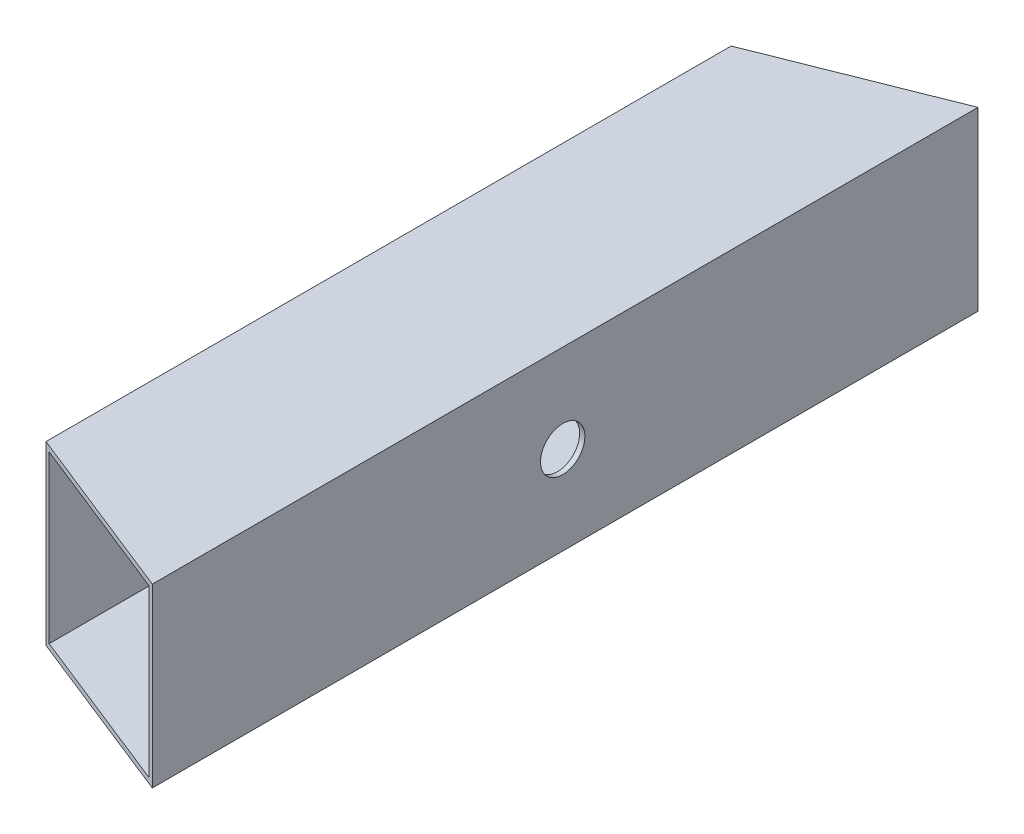
ISO-10303-21;
HEADER;
FILE_DESCRIPTION(('STEP AP214'),'2;1');
FILE_NAME('part.step','',(''),(''),'','','');
FILE_SCHEMA(('AUTOMOTIVE_DESIGN { 1 0 10303 214 1 1 1 1 }'));
ENDSEC;
DATA;
#1=APPLICATION_CONTEXT('core data for automotive mechanical design processes');
#2=APPLICATION_PROTOCOL_DEFINITION('international standard','automotive_design',2000,#1);
#3=PRODUCT_CONTEXT('',#1,'mechanical');
#4=PRODUCT('Part','Part','',(#3));
#5=PRODUCT_RELATED_PRODUCT_CATEGORY('part','',(#4));
#6=PRODUCT_DEFINITION_FORMATION('','',#4);
#7=PRODUCT_DEFINITION_CONTEXT('part definition',#1,'design');
#8=PRODUCT_DEFINITION('design','',#6,#7);
#9=PRODUCT_DEFINITION_SHAPE('','',#8);
#10=(LENGTH_UNIT() NAMED_UNIT(*) SI_UNIT(.MILLI.,.METRE.));
#11=(NAMED_UNIT(*) PLANE_ANGLE_UNIT() SI_UNIT($,.RADIAN.));
#12=(NAMED_UNIT(*) SI_UNIT($,.STERADIAN.) SOLID_ANGLE_UNIT());
#13=UNCERTAINTY_MEASURE_WITH_UNIT(LENGTH_MEASURE(1.E-05),#10,'distance_accuracy_value','');
#14=(GEOMETRIC_REPRESENTATION_CONTEXT(3) GLOBAL_UNCERTAINTY_ASSIGNED_CONTEXT((#13)) GLOBAL_UNIT_ASSIGNED_CONTEXT((#10,
#11,#12)) REPRESENTATION_CONTEXT('',''));
#15=CARTESIAN_POINT('',(0.,0.,0.));
#16=DIRECTION('',(0.,0.,1.));
#17=DIRECTION('',(1.,0.,0.));
#18=AXIS2_PLACEMENT_3D('',#15,#16,#17);
#19=CARTESIAN_POINT('',(-15.9452234480182,15.9452234480182,149.11688245));
#20=DIRECTION('',(0.,-1.,0.));
#21=DIRECTION('',(0.,0.,-1.));
#22=AXIS2_PLACEMENT_3D('',#19,#20,#21);
#23=PLANE('',#22);
#24=DIRECTION('',(0.,0.,-1.));
#25=VECTOR('',#24,1.);
#26=CARTESIAN_POINT('',(-15.9452234480182,15.9452234480182,149.11688245));
#27=LINE('',#26,#25);
#28=CARTESIAN_POINT('',(-15.9452234480182,15.9452234480182,136.424287616364));
#29=VERTEX_POINT('',#28);
#30=CARTESIAN_POINT('',(-15.9452234480182,15.9452234480182,12.6925948336361));
#31=VERTEX_POINT('',#30);
#32=EDGE_CURVE('E120',#29,#31,#27,.T.);
#33=ORIENTED_EDGE('',*,*,#32,.F.);
#34=DIRECTION('',(0.92911410701226,0.,0.369793153196229));
#35=VECTOR('',#34,1.);
#36=CARTESIAN_POINT('',(-11.5843012668873,15.9452234480182,138.159961579371));
#37=LINE('',#36,#35);
#38=CARTESIAN_POINT('',(15.9452234480182,15.9452259480182,149.11688245));
#39=VERTEX_POINT('',#38);
#40=EDGE_CURVE('E104',#29,#39,#37,.T.);
#41=ORIENTED_EDGE('',*,*,#40,.T.);
#42=DIRECTION('',(0.,0.,-1.));
#43=VECTOR('',#42,1.);
#44=CARTESIAN_POINT('',(15.9452234480182,15.9452234480182,149.11688245));
#45=LINE('',#44,#43);
#46=CARTESIAN_POINT('',(15.9452234480182,15.9452234480182,0.));
#47=VERTEX_POINT('',#46);
#48=EDGE_CURVE('E42',#39,#47,#45,.T.);
#49=ORIENTED_EDGE('',*,*,#48,.T.);
#50=DIRECTION('',(0.92911410701226,0.,-0.369793153196229));
#51=VECTOR('',#50,1.);
#52=CARTESIAN_POINT('',(-62.8178850045487,15.9452234480182,31.3482036387022));
#53=LINE('',#52,#51);
#54=EDGE_CURVE('E153',#31,#47,#53,.T.);
#55=ORIENTED_EDGE('',*,*,#54,.F.);
#56=EDGE_LOOP('',(#33,#41,#49,#55));
#57=FACE_BOUND('',#56,.T.);
#58=ADVANCED_FACE('F33',(#57),#23,.F.);
#59=CARTESIAN_POINT('',(-15.9452234480182,-15.9452234480182,149.11688245));
#60=DIRECTION('',(1.,0.,0.));
#61=DIRECTION('',(0.,0.,-1.));
#62=AXIS2_PLACEMENT_3D('',#59,#60,#61);
#63=PLANE('',#62);
#64=CARTESIAN_POINT('',(-15.9452234480182,0.,75.));
#65=DIRECTION('',(-1.,0.,0.));
#66=DIRECTION('',(0.,0.,1.));
#67=AXIS2_PLACEMENT_3D('',#64,#65,#66);
#68=CIRCLE('',#67,4.00000000000001);
#69=CARTESIAN_POINT('',(-15.9452234480182,0.,79.));
#70=VERTEX_POINT('',#69);
#71=EDGE_CURVE('E307',#70,#70,#68,.T.);
#72=ORIENTED_EDGE('',*,*,#71,.F.);
#73=EDGE_LOOP('',(#72));
#74=FACE_BOUND('',#73,.T.);
#75=DIRECTION('',(0.,0.,-1.));
#76=VECTOR('',#75,1.);
#77=CARTESIAN_POINT('',(-15.9452234480182,-15.9452234480182,149.11688245));
#78=LINE('',#77,#76);
#79=CARTESIAN_POINT('',(-15.9452234480182,-15.9452234480182,136.424287616364));
#80=VERTEX_POINT('',#79);
#81=CARTESIAN_POINT('',(-15.9452234480182,-15.9452234480182,12.6925948336361));
#82=VERTEX_POINT('',#81);
#83=EDGE_CURVE('E124',#80,#82,#78,.T.);
#84=ORIENTED_EDGE('',*,*,#83,.F.);
#85=DIRECTION('',(0.,1.,0.));
#86=VECTOR('',#85,1.);
#87=CARTESIAN_POINT('',(-15.9452234480182,-15.9452484480182,136.424287616364));
#88=LINE('',#87,#86);
#89=EDGE_CURVE('E172',#80,#29,#88,.T.);
#90=ORIENTED_EDGE('',*,*,#89,.T.);
#91=ORIENTED_EDGE('',*,*,#32,.T.);
#92=DIRECTION('',(0.,1.,0.));
#93=VECTOR('',#92,1.);
#94=CARTESIAN_POINT('',(-15.9452234480182,-15.9452234480182,12.6925948336361));
#95=LINE('',#94,#93);
#96=EDGE_CURVE('E142',#82,#31,#95,.T.);
#97=ORIENTED_EDGE('',*,*,#96,.F.);
#98=EDGE_LOOP('',(#84,#90,#91,#97));
#99=FACE_BOUND('',#98,.T.);
#100=ADVANCED_FACE('F171',(#74,#99),#63,.F.);
#101=CARTESIAN_POINT('',(-15.9452234480182,-15.9452234480182,149.11688245));
#102=DIRECTION('',(0.,1.,0.));
#103=DIRECTION('',(0.,0.,1.));
#104=AXIS2_PLACEMENT_3D('',#101,#102,#103);
#105=PLANE('',#104);
#106=DIRECTION('',(0.,0.,-1.));
#107=VECTOR('',#106,1.);
#108=CARTESIAN_POINT('',(15.9452234480182,-15.9452234480182,149.11688245));
#109=LINE('',#108,#107);
#110=CARTESIAN_POINT('',(15.9452234480182,-15.9452259480182,149.11688245));
#111=VERTEX_POINT('',#110);
#112=CARTESIAN_POINT('',(15.9452234480182,-15.9452234480182,0.));
#113=VERTEX_POINT('',#112);
#114=EDGE_CURVE('E112',#111,#113,#109,.T.);
#115=ORIENTED_EDGE('',*,*,#114,.F.);
#116=DIRECTION('',(-0.92911410701226,0.,-0.369793153196229));
#117=VECTOR('',#116,1.);
#118=CARTESIAN_POINT('',(-11.5843012668873,-15.9452234480182,138.159961579371));
#119=LINE('',#118,#117);
#120=EDGE_CURVE('E107',#111,#80,#119,.T.);
#121=ORIENTED_EDGE('',*,*,#120,.T.);
#122=ORIENTED_EDGE('',*,*,#83,.T.);
#123=DIRECTION('',(-0.92911410701226,0.,0.369793153196229));
#124=VECTOR('',#123,1.);
#125=CARTESIAN_POINT('',(2.18046109056548,-15.9452234480182,5.47846043531448));
#126=LINE('',#125,#124);
#127=EDGE_CURVE('E121',#113,#82,#126,.T.);
#128=ORIENTED_EDGE('',*,*,#127,.F.);
#129=EDGE_LOOP('',(#115,#121,#122,#128));
#130=FACE_BOUND('',#129,.T.);
#131=ADVANCED_FACE('F166',(#130),#105,.F.);
#132=CARTESIAN_POINT('',(15.,-15.,149.11688245));
#133=DIRECTION('',(-1.,0.,0.));
#134=DIRECTION('',(0.,0.,1.));
#135=AXIS2_PLACEMENT_3D('',#132,#133,#134);
#136=PLANE('',#135);
#137=CARTESIAN_POINT('',(15.,0.,75.));
#138=DIRECTION('',(-1.,0.,0.));
#139=DIRECTION('',(0.,0.,1.));
#140=AXIS2_PLACEMENT_3D('',#137,#138,#139);
#141=CIRCLE('',#140,4.00000000000001);
#142=CARTESIAN_POINT('',(15.,0.,79.));
#143=VERTEX_POINT('',#142);
#144=EDGE_CURVE('E174',#143,#143,#141,.T.);
#145=ORIENTED_EDGE('',*,*,#144,.F.);
#146=EDGE_LOOP('',(#145));
#147=FACE_BOUND('',#146,.T.);
#148=DIRECTION('',(0.,-1.,0.));
#149=VECTOR('',#148,1.);
#150=CARTESIAN_POINT('',(15.,-15.,148.740677679585));
#151=LINE('',#150,#149);
#152=CARTESIAN_POINT('',(15.,15.,148.740677679585));
#153=VERTEX_POINT('',#152);
#154=CARTESIAN_POINT('',(15.,-15.,148.740677679585));
#155=VERTEX_POINT('',#154);
#156=EDGE_CURVE('E50',#153,#155,#151,.T.);
#157=ORIENTED_EDGE('',*,*,#156,.F.);
#158=DIRECTION('',(0.,0.,-1.));
#159=VECTOR('',#158,1.);
#160=CARTESIAN_POINT('',(15.,15.,149.11688245));
#161=LINE('',#160,#159);
#162=CARTESIAN_POINT('',(15.,15.,0.376204770414758));
#163=VERTEX_POINT('',#162);
#164=EDGE_CURVE('E130',#153,#163,#161,.T.);
#165=ORIENTED_EDGE('',*,*,#164,.T.);
#166=DIRECTION('',(0.,-1.,0.));
#167=VECTOR('',#166,1.);
#168=CARTESIAN_POINT('',(15.,-15.,0.376204770414751));
#169=LINE('',#168,#167);
#170=CARTESIAN_POINT('',(15.,-15.,0.376204770414758));
#171=VERTEX_POINT('',#170);
#172=EDGE_CURVE('E150',#163,#171,#169,.T.);
#173=ORIENTED_EDGE('',*,*,#172,.T.);
#174=DIRECTION('',(0.,0.,-1.));
#175=VECTOR('',#174,1.);
#176=CARTESIAN_POINT('',(15.,-15.,149.11688245));
#177=LINE('',#176,#175);
#178=EDGE_CURVE('E155',#155,#171,#177,.T.);
#179=ORIENTED_EDGE('',*,*,#178,.F.);
#180=EDGE_LOOP('',(#157,#165,#173,#179));
#181=FACE_BOUND('',#180,.T.);
#182=ADVANCED_FACE('F192',(#147,#181),#136,.T.);
#183=CARTESIAN_POINT('',(-15.,15.,149.11688245));
#184=DIRECTION('',(0.,-1.,0.));
#185=DIRECTION('',(0.,0.,-1.));
#186=AXIS2_PLACEMENT_3D('',#183,#184,#185);
#187=PLANE('',#186);
#188=DIRECTION('',(0.92911410701226,0.,0.369793153196229));
#189=VECTOR('',#188,1.);
#190=CARTESIAN_POINT('',(-10.7683342671724,15.,138.484721485018));
#191=LINE('',#190,#189);
#192=CARTESIAN_POINT('',(-15.,15.,136.800492386779));
#193=VERTEX_POINT('',#192);
#194=EDGE_CURVE('E184',#193,#153,#191,.T.);
#195=ORIENTED_EDGE('',*,*,#194,.F.);
#196=DIRECTION('',(0.,0.,-1.));
#197=VECTOR('',#196,1.);
#198=CARTESIAN_POINT('',(-15.,15.,149.11688245));
#199=LINE('',#198,#197);
#200=CARTESIAN_POINT('',(-15.,15.,12.3163900632213));
#201=VERTEX_POINT('',#200);
#202=EDGE_CURVE('E160',#193,#201,#199,.T.);
#203=ORIENTED_EDGE('',*,*,#202,.T.);
#204=DIRECTION('',(0.92911410701226,0.,-0.369793153196229));
#205=VECTOR('',#204,1.);
#206=CARTESIAN_POINT('',(-62.0019180048338,15.,31.0234437330552));
#207=LINE('',#206,#205);
#208=EDGE_CURVE('E147',#201,#163,#207,.T.);
#209=ORIENTED_EDGE('',*,*,#208,.T.);
#210=ORIENTED_EDGE('',*,*,#164,.F.);
#211=EDGE_LOOP('',(#195,#203,#209,#210));
#212=FACE_BOUND('',#211,.T.);
#213=ADVANCED_FACE('F194',(#212),#187,.T.);
#214=CARTESIAN_POINT('',(-15.,-15.,149.11688245));
#215=DIRECTION('',(1.,0.,0.));
#216=DIRECTION('',(0.,0.,-1.));
#217=AXIS2_PLACEMENT_3D('',#214,#215,#216);
#218=PLANE('',#217);
#219=CARTESIAN_POINT('',(-15.,0.,75.));
#220=DIRECTION('',(1.,0.,0.));
#221=DIRECTION('',(0.,0.,-1.));
#222=AXIS2_PLACEMENT_3D('',#219,#220,#221);
#223=CIRCLE('',#222,4.00000000000001);
#224=CARTESIAN_POINT('',(-15.,0.,71.));
#225=VERTEX_POINT('',#224);
#226=EDGE_CURVE('E179',#225,#225,#223,.T.);
#227=ORIENTED_EDGE('',*,*,#226,.F.);
#228=EDGE_LOOP('',(#227));
#229=FACE_BOUND('',#228,.T.);
#230=DIRECTION('',(0.,1.,0.));
#231=VECTOR('',#230,1.);
#232=CARTESIAN_POINT('',(-15.,-15.,136.800492386779));
#233=LINE('',#232,#231);
#234=CARTESIAN_POINT('',(-15.,-15.,136.800492386779));
#235=VERTEX_POINT('',#234);
#236=EDGE_CURVE('E176',#235,#193,#233,.T.);
#237=ORIENTED_EDGE('',*,*,#236,.F.);
#238=DIRECTION('',(0.,0.,-1.));
#239=VECTOR('',#238,1.);
#240=CARTESIAN_POINT('',(-15.,-15.,149.11688245));
#241=LINE('',#240,#239);
#242=CARTESIAN_POINT('',(-15.,-15.,12.3163900632213));
#243=VERTEX_POINT('',#242);
#244=EDGE_CURVE('E58',#235,#243,#241,.T.);
#245=ORIENTED_EDGE('',*,*,#244,.T.);
#246=DIRECTION('',(0.,1.,0.));
#247=VECTOR('',#246,1.);
#248=CARTESIAN_POINT('',(-15.,-15.,12.3163900632213));
#249=LINE('',#248,#247);
#250=EDGE_CURVE('E145',#243,#201,#249,.T.);
#251=ORIENTED_EDGE('',*,*,#250,.T.);
#252=ORIENTED_EDGE('',*,*,#202,.F.);
#253=EDGE_LOOP('',(#237,#245,#251,#252));
#254=FACE_BOUND('',#253,.T.);
#255=ADVANCED_FACE('F198',(#229,#254),#218,.T.);
#256=CARTESIAN_POINT('',(-15.,-15.,149.11688245));
#257=DIRECTION('',(0.,1.,0.));
#258=DIRECTION('',(0.,0.,1.));
#259=AXIS2_PLACEMENT_3D('',#256,#257,#258);
#260=PLANE('',#259);
#261=DIRECTION('',(-0.92911410701226,0.,-0.369793153196229));
#262=VECTOR('',#261,1.);
#263=CARTESIAN_POINT('',(-10.7683342671724,-15.,138.484721485018));
#264=LINE('',#263,#262);
#265=EDGE_CURVE('E173',#155,#235,#264,.T.);
#266=ORIENTED_EDGE('',*,*,#265,.F.);
#267=ORIENTED_EDGE('',*,*,#178,.T.);
#268=DIRECTION('',(-0.92911410701226,0.,0.369793153196229));
#269=VECTOR('',#268,1.);
#270=CARTESIAN_POINT('',(-62.0019180048338,-15.,31.0234437330552));
#271=LINE('',#270,#269);
#272=EDGE_CURVE('E11',#171,#243,#271,.T.);
#273=ORIENTED_EDGE('',*,*,#272,.T.);
#274=ORIENTED_EDGE('',*,*,#244,.F.);
#275=EDGE_LOOP('',(#266,#267,#273,#274));
#276=FACE_BOUND('',#275,.T.);
#277=ADVANCED_FACE('F200',(#276),#260,.T.);
#278=CARTESIAN_POINT('',(15.9452234480182,-15.9452234480182,149.11688245));
#279=DIRECTION('',(-1.,0.,0.));
#280=DIRECTION('',(0.,0.,1.));
#281=AXIS2_PLACEMENT_3D('',#278,#279,#280);
#282=PLANE('',#281);
#283=CARTESIAN_POINT('',(15.9452234480182,0.,75.));
#284=DIRECTION('',(-1.,0.,0.));
#285=DIRECTION('',(0.,0.,1.));
#286=AXIS2_PLACEMENT_3D('',#283,#284,#285);
#287=CIRCLE('',#286,4.00000000000001);
#288=CARTESIAN_POINT('',(15.9452234480182,0.,79.));
#289=VERTEX_POINT('',#288);
#290=EDGE_CURVE('E37',#289,#289,#287,.T.);
#291=ORIENTED_EDGE('',*,*,#290,.T.);
#292=EDGE_LOOP('',(#291));
#293=FACE_BOUND('',#292,.T.);
#294=DIRECTION('',(0.,1.,0.));
#295=VECTOR('',#294,1.);
#296=CARTESIAN_POINT('',(15.9452234480182,-15.9452234480182,0.));
#297=LINE('',#296,#295);
#298=EDGE_CURVE('E113',#113,#47,#297,.T.);
#299=ORIENTED_EDGE('',*,*,#298,.T.);
#300=ORIENTED_EDGE('',*,*,#48,.F.);
#301=DIRECTION('',(0.,1.,0.));
#302=VECTOR('',#301,1.);
#303=CARTESIAN_POINT('',(15.9452234480182,-15.9452234480182,149.11688245));
#304=LINE('',#303,#302);
#305=EDGE_CURVE('E101',#111,#39,#304,.T.);
#306=ORIENTED_EDGE('',*,*,#305,.F.);
#307=ORIENTED_EDGE('',*,*,#114,.T.);
#308=EDGE_LOOP('',(#299,#300,#306,#307));
#309=FACE_BOUND('',#308,.T.);
#310=ADVANCED_FACE('F35',(#293,#309),#282,.F.);
#311=CARTESIAN_POINT('',(2.18046109056548,-15.9452234480182,5.47846043531448));
#312=DIRECTION('',(-0.369793153196229,0.,-0.92911410701226));
#313=DIRECTION('',(-0.92911410701226,0.,0.369793153196229));
#314=AXIS2_PLACEMENT_3D('',#311,#312,#313);
#315=PLANE('',#314);
#316=ORIENTED_EDGE('',*,*,#208,.F.);
#317=ORIENTED_EDGE('',*,*,#250,.F.);
#318=ORIENTED_EDGE('',*,*,#272,.F.);
#319=ORIENTED_EDGE('',*,*,#172,.F.);
#320=EDGE_LOOP('',(#316,#317,#318,#319));
#321=FACE_BOUND('',#320,.T.);
#322=ORIENTED_EDGE('',*,*,#54,.T.);
#323=ORIENTED_EDGE('',*,*,#298,.F.);
#324=ORIENTED_EDGE('',*,*,#127,.T.);
#325=ORIENTED_EDGE('',*,*,#96,.T.);
#326=EDGE_LOOP('',(#322,#323,#324,#325));
#327=FACE_BOUND('',#326,.T.);
#328=ADVANCED_FACE('F169',(#321,#327),#315,.T.);
#329=CARTESIAN_POINT('',(2.18046109056548,-15.9452484480182,143.638422014686));
#330=DIRECTION('',(0.369793153196229,0.,-0.92911410701226));
#331=DIRECTION('',(-0.92911410701226,0.,-0.369793153196229));
#332=AXIS2_PLACEMENT_3D('',#329,#330,#331);
#333=PLANE('',#332);
#334=ORIENTED_EDGE('',*,*,#156,.T.);
#335=ORIENTED_EDGE('',*,*,#265,.T.);
#336=ORIENTED_EDGE('',*,*,#236,.T.);
#337=ORIENTED_EDGE('',*,*,#194,.T.);
#338=EDGE_LOOP('',(#334,#335,#336,#337));
#339=FACE_BOUND('',#338,.T.);
#340=ORIENTED_EDGE('',*,*,#89,.F.);
#341=ORIENTED_EDGE('',*,*,#120,.F.);
#342=ORIENTED_EDGE('',*,*,#305,.T.);
#343=ORIENTED_EDGE('',*,*,#40,.F.);
#344=EDGE_LOOP('',(#340,#341,#342,#343));
#345=FACE_BOUND('',#344,.T.);
#346=ADVANCED_FACE('F103',(#339,#345),#333,.F.);
#347=CARTESIAN_POINT('',(16.0547765519818,0.,75.));
#348=DIRECTION('',(-1.,0.,0.));
#349=DIRECTION('',(0.,0.,1.));
#350=AXIS2_PLACEMENT_3D('',#347,#348,#349);
#351=CYLINDRICAL_SURFACE('',#350,4.00000000000001);
#352=ORIENTED_EDGE('',*,*,#144,.T.);
#353=EDGE_LOOP('',(#352));
#354=FACE_BOUND('',#353,.T.);
#355=ORIENTED_EDGE('',*,*,#290,.F.);
#356=EDGE_LOOP('',(#355));
#357=FACE_BOUND('',#356,.T.);
#358=ADVANCED_FACE('F249',(#354,#357),#351,.F.);
#359=ORIENTED_EDGE('',*,*,#226,.T.);
#360=EDGE_LOOP('',(#359));
#361=FACE_BOUND('',#360,.T.);
#362=ORIENTED_EDGE('',*,*,#71,.T.);
#363=EDGE_LOOP('',(#362));
#364=FACE_BOUND('',#363,.T.);
#365=ADVANCED_FACE('F254',(#361,#364),#351,.F.);
#366=CLOSED_SHELL('',(#58,#100,#131,#182,#213,#255,#277,#310,#328,#346,#358,#365));
#367=MANIFOLD_SOLID_BREP('B2',#366);
#368=ADVANCED_BREP_SHAPE_REPRESENTATION('',(#18,#367),#14);
#369=SHAPE_DEFINITION_REPRESENTATION(#9,#368);
ENDSEC;
END-ISO-10303-21;
